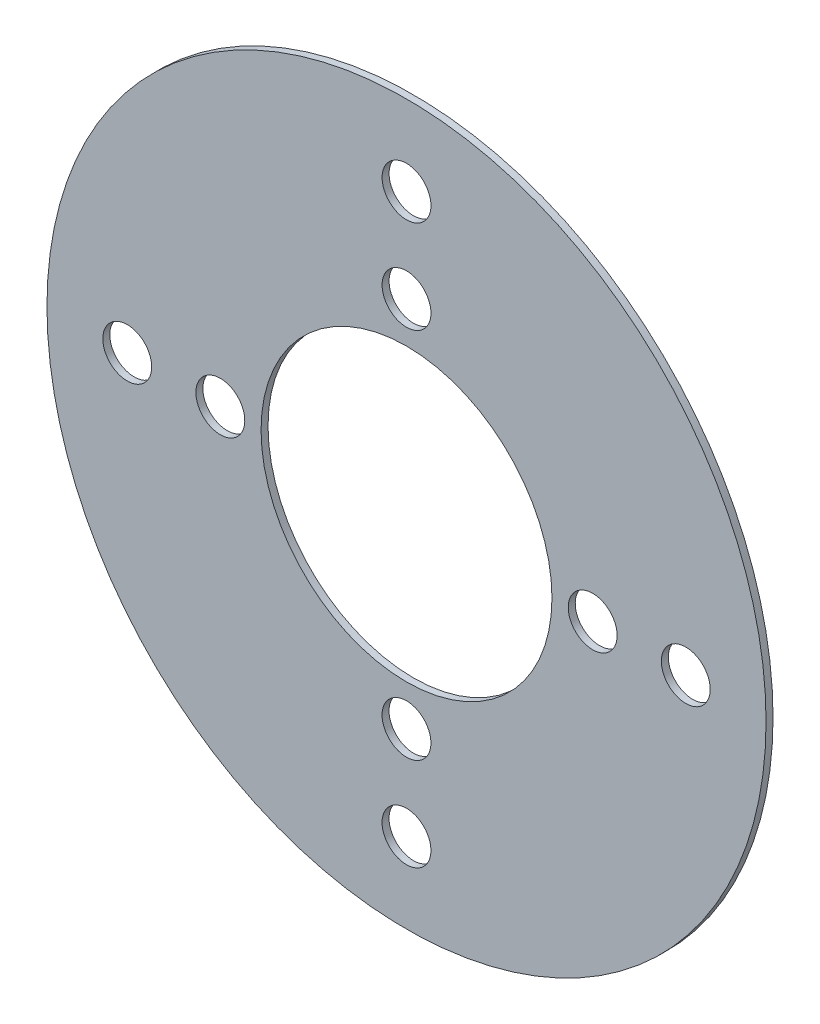
ISO-10303-21;
HEADER;
FILE_DESCRIPTION(('STEP AP214'),'2;1');
FILE_NAME('part.step','',(''),(''),'','','');
FILE_SCHEMA(('AUTOMOTIVE_DESIGN { 1 0 10303 214 1 1 1 1 }'));
ENDSEC;
DATA;
#1=APPLICATION_CONTEXT('core data for automotive mechanical design processes');
#2=APPLICATION_PROTOCOL_DEFINITION('international standard','automotive_design',2000,#1);
#3=PRODUCT_CONTEXT('',#1,'mechanical');
#4=PRODUCT('Part','Part','',(#3));
#5=PRODUCT_RELATED_PRODUCT_CATEGORY('part','',(#4));
#6=PRODUCT_DEFINITION_FORMATION('','',#4);
#7=PRODUCT_DEFINITION_CONTEXT('part definition',#1,'design');
#8=PRODUCT_DEFINITION('design','',#6,#7);
#9=PRODUCT_DEFINITION_SHAPE('','',#8);
#10=(LENGTH_UNIT() NAMED_UNIT(*) SI_UNIT(.MILLI.,.METRE.));
#11=(NAMED_UNIT(*) PLANE_ANGLE_UNIT() SI_UNIT($,.RADIAN.));
#12=(NAMED_UNIT(*) SI_UNIT($,.STERADIAN.) SOLID_ANGLE_UNIT());
#13=UNCERTAINTY_MEASURE_WITH_UNIT(LENGTH_MEASURE(1.E-05),#10,'distance_accuracy_value','');
#14=(GEOMETRIC_REPRESENTATION_CONTEXT(3) GLOBAL_UNCERTAINTY_ASSIGNED_CONTEXT((#13)) GLOBAL_UNIT_ASSIGNED_CONTEXT((#10,
#11,#12)) REPRESENTATION_CONTEXT('',''));
#15=CARTESIAN_POINT('',(0.,0.,0.));
#16=DIRECTION('',(0.,0.,1.));
#17=DIRECTION('',(1.,0.,0.));
#18=AXIS2_PLACEMENT_3D('',#15,#16,#17);
#19=CARTESIAN_POINT('',(0.,0.,0.6));
#20=DIRECTION('',(0.,0.,1.));
#21=DIRECTION('',(1.,0.,0.));
#22=AXIS2_PLACEMENT_3D('',#19,#20,#21);
#23=PLANE('',#22);
#24=CARTESIAN_POINT('',(-16.,1.6759110426447E-13,0.6));
#25=DIRECTION('',(0.,0.,1.));
#26=DIRECTION('',(0.,1.,0.));
#27=AXIS2_PLACEMENT_3D('',#24,#25,#26);
#28=CIRCLE('',#27,2.1);
#29=CARTESIAN_POINT('',(-16.,2.10000000000017,0.6));
#30=VERTEX_POINT('',#29);
#31=EDGE_CURVE('E90',#30,#30,#28,.T.);
#32=ORIENTED_EDGE('',*,*,#31,.F.);
#33=EDGE_LOOP('',(#32));
#34=FACE_BOUND('',#33,.T.);
#35=CARTESIAN_POINT('',(0.,-16.,0.6));
#36=DIRECTION('',(0.,0.,1.));
#37=DIRECTION('',(-1.,0.,0.));
#38=AXIS2_PLACEMENT_3D('',#35,#36,#37);
#39=CIRCLE('',#38,2.1);
#40=CARTESIAN_POINT('',(-2.1,-16.,0.6));
#41=VERTEX_POINT('',#40);
#42=EDGE_CURVE('E84',#41,#41,#39,.T.);
#43=ORIENTED_EDGE('',*,*,#42,.F.);
#44=EDGE_LOOP('',(#43));
#45=FACE_BOUND('',#44,.T.);
#46=CARTESIAN_POINT('',(16.,0.,0.6));
#47=DIRECTION('',(0.,0.,1.));
#48=DIRECTION('',(0.,-1.,0.));
#49=AXIS2_PLACEMENT_3D('',#46,#47,#48);
#50=CIRCLE('',#49,2.1);
#51=CARTESIAN_POINT('',(16.,-2.10000000000006,0.6));
#52=VERTEX_POINT('',#51);
#53=EDGE_CURVE('E78',#52,#52,#50,.T.);
#54=ORIENTED_EDGE('',*,*,#53,.F.);
#55=EDGE_LOOP('',(#54));
#56=FACE_BOUND('',#55,.T.);
#57=CARTESIAN_POINT('',(-24.,2.51386656396706E-13,0.6));
#58=DIRECTION('',(0.,0.,1.));
#59=DIRECTION('',(0.,1.,0.));
#60=AXIS2_PLACEMENT_3D('',#57,#58,#59);
#61=CIRCLE('',#60,2.1);
#62=CARTESIAN_POINT('',(-24.,2.10000000000025,0.6));
#63=VERTEX_POINT('',#62);
#64=EDGE_CURVE('E72',#63,#63,#61,.T.);
#65=ORIENTED_EDGE('',*,*,#64,.F.);
#66=EDGE_LOOP('',(#65));
#67=FACE_BOUND('',#66,.T.);
#68=CARTESIAN_POINT('',(0.,-24.,0.6));
#69=DIRECTION('',(0.,0.,1.));
#70=DIRECTION('',(-1.,0.,0.));
#71=AXIS2_PLACEMENT_3D('',#68,#69,#70);
#72=CIRCLE('',#71,2.1);
#73=CARTESIAN_POINT('',(-2.1,-24.,0.6));
#74=VERTEX_POINT('',#73);
#75=EDGE_CURVE('E66',#74,#74,#72,.T.);
#76=ORIENTED_EDGE('',*,*,#75,.F.);
#77=EDGE_LOOP('',(#76));
#78=FACE_BOUND('',#77,.T.);
#79=CARTESIAN_POINT('',(24.,0.,0.6));
#80=DIRECTION('',(0.,0.,1.));
#81=DIRECTION('',(0.,-1.,0.));
#82=AXIS2_PLACEMENT_3D('',#79,#80,#81);
#83=CIRCLE('',#82,2.1);
#84=CARTESIAN_POINT('',(24.,-2.10000000000008,0.6));
#85=VERTEX_POINT('',#84);
#86=EDGE_CURVE('E58',#85,#85,#83,.T.);
#87=ORIENTED_EDGE('',*,*,#86,.F.);
#88=EDGE_LOOP('',(#87));
#89=FACE_BOUND('',#88,.T.);
#90=CARTESIAN_POINT('',(0.,24.,0.6));
#91=DIRECTION('',(0.,0.,1.));
#92=DIRECTION('',(1.,0.,0.));
#93=AXIS2_PLACEMENT_3D('',#90,#91,#92);
#94=CIRCLE('',#93,2.1);
#95=CARTESIAN_POINT('',(2.1,24.,0.6));
#96=VERTEX_POINT('',#95);
#97=EDGE_CURVE('E55',#96,#96,#94,.T.);
#98=ORIENTED_EDGE('',*,*,#97,.F.);
#99=EDGE_LOOP('',(#98));
#100=FACE_BOUND('',#99,.T.);
#101=CARTESIAN_POINT('',(0.,16.,0.6));
#102=DIRECTION('',(0.,0.,1.));
#103=DIRECTION('',(1.,0.,0.));
#104=AXIS2_PLACEMENT_3D('',#101,#102,#103);
#105=CIRCLE('',#104,2.1);
#106=CARTESIAN_POINT('',(2.1,16.,0.6));
#107=VERTEX_POINT('',#106);
#108=EDGE_CURVE('E49',#107,#107,#105,.T.);
#109=ORIENTED_EDGE('',*,*,#108,.F.);
#110=EDGE_LOOP('',(#109));
#111=FACE_BOUND('',#110,.T.);
#112=CARTESIAN_POINT('',(0.,0.,0.6));
#113=DIRECTION('',(0.,0.,1.));
#114=DIRECTION('',(1.,0.,0.));
#115=AXIS2_PLACEMENT_3D('',#112,#113,#114);
#116=CIRCLE('',#115,30.9);
#117=CARTESIAN_POINT('',(30.9,0.,0.6));
#118=VERTEX_POINT('',#117);
#119=EDGE_CURVE('E10',#118,#118,#116,.T.);
#120=ORIENTED_EDGE('',*,*,#119,.T.);
#121=EDGE_LOOP('',(#120));
#122=FACE_BOUND('',#121,.T.);
#123=CARTESIAN_POINT('',(0.,0.,0.6));
#124=DIRECTION('',(0.,0.,1.));
#125=DIRECTION('',(1.,0.,0.));
#126=AXIS2_PLACEMENT_3D('',#123,#124,#125);
#127=CIRCLE('',#126,12.5);
#128=CARTESIAN_POINT('',(12.5,0.,0.6));
#129=VERTEX_POINT('',#128);
#130=EDGE_CURVE('E41',#129,#129,#127,.T.);
#131=ORIENTED_EDGE('',*,*,#130,.F.);
#132=EDGE_LOOP('',(#131));
#133=FACE_BOUND('',#132,.T.);
#134=ADVANCED_FACE('F30',(#34,#45,#56,#67,#78,#89,#100,#111,#122,#133),#23,.T.);
#135=CARTESIAN_POINT('',(0.,0.,0.));
#136=DIRECTION('',(0.,0.,1.));
#137=DIRECTION('',(1.,0.,0.));
#138=AXIS2_PLACEMENT_3D('',#135,#136,#137);
#139=PLANE('',#138);
#140=CARTESIAN_POINT('',(-16.,1.6759110426447E-13,0.));
#141=DIRECTION('',(0.,0.,1.));
#142=DIRECTION('',(0.,1.,0.));
#143=AXIS2_PLACEMENT_3D('',#140,#141,#142);
#144=CIRCLE('',#143,2.1);
#145=CARTESIAN_POINT('',(-16.,2.10000000000017,0.));
#146=VERTEX_POINT('',#145);
#147=EDGE_CURVE('E93',#146,#146,#144,.T.);
#148=ORIENTED_EDGE('',*,*,#147,.T.);
#149=EDGE_LOOP('',(#148));
#150=FACE_BOUND('',#149,.T.);
#151=CARTESIAN_POINT('',(0.,-16.,0.));
#152=DIRECTION('',(0.,0.,1.));
#153=DIRECTION('',(-1.,0.,0.));
#154=AXIS2_PLACEMENT_3D('',#151,#152,#153);
#155=CIRCLE('',#154,2.1);
#156=CARTESIAN_POINT('',(-2.1,-16.,0.));
#157=VERTEX_POINT('',#156);
#158=EDGE_CURVE('E87',#157,#157,#155,.T.);
#159=ORIENTED_EDGE('',*,*,#158,.T.);
#160=EDGE_LOOP('',(#159));
#161=FACE_BOUND('',#160,.T.);
#162=CARTESIAN_POINT('',(16.,0.,0.));
#163=DIRECTION('',(0.,0.,1.));
#164=DIRECTION('',(0.,-1.,0.));
#165=AXIS2_PLACEMENT_3D('',#162,#163,#164);
#166=CIRCLE('',#165,2.1);
#167=CARTESIAN_POINT('',(16.,-2.10000000000006,0.));
#168=VERTEX_POINT('',#167);
#169=EDGE_CURVE('E81',#168,#168,#166,.T.);
#170=ORIENTED_EDGE('',*,*,#169,.T.);
#171=EDGE_LOOP('',(#170));
#172=FACE_BOUND('',#171,.T.);
#173=CARTESIAN_POINT('',(-24.,2.51386656396706E-13,0.));
#174=DIRECTION('',(0.,0.,1.));
#175=DIRECTION('',(0.,1.,0.));
#176=AXIS2_PLACEMENT_3D('',#173,#174,#175);
#177=CIRCLE('',#176,2.1);
#178=CARTESIAN_POINT('',(-24.,2.10000000000025,0.));
#179=VERTEX_POINT('',#178);
#180=EDGE_CURVE('E75',#179,#179,#177,.T.);
#181=ORIENTED_EDGE('',*,*,#180,.T.);
#182=EDGE_LOOP('',(#181));
#183=FACE_BOUND('',#182,.T.);
#184=CARTESIAN_POINT('',(0.,-24.,0.));
#185=DIRECTION('',(0.,0.,1.));
#186=DIRECTION('',(-1.,0.,0.));
#187=AXIS2_PLACEMENT_3D('',#184,#185,#186);
#188=CIRCLE('',#187,2.1);
#189=CARTESIAN_POINT('',(-2.1,-24.,0.));
#190=VERTEX_POINT('',#189);
#191=EDGE_CURVE('E69',#190,#190,#188,.T.);
#192=ORIENTED_EDGE('',*,*,#191,.T.);
#193=EDGE_LOOP('',(#192));
#194=FACE_BOUND('',#193,.T.);
#195=CARTESIAN_POINT('',(24.,0.,0.));
#196=DIRECTION('',(0.,0.,1.));
#197=DIRECTION('',(0.,-1.,0.));
#198=AXIS2_PLACEMENT_3D('',#195,#196,#197);
#199=CIRCLE('',#198,2.1);
#200=CARTESIAN_POINT('',(24.,-2.10000000000008,0.));
#201=VERTEX_POINT('',#200);
#202=EDGE_CURVE('E63',#201,#201,#199,.T.);
#203=ORIENTED_EDGE('',*,*,#202,.T.);
#204=EDGE_LOOP('',(#203));
#205=FACE_BOUND('',#204,.T.);
#206=CARTESIAN_POINT('',(0.,24.,0.));
#207=DIRECTION('',(0.,0.,1.));
#208=DIRECTION('',(1.,0.,0.));
#209=AXIS2_PLACEMENT_3D('',#206,#207,#208);
#210=CIRCLE('',#209,2.1);
#211=CARTESIAN_POINT('',(2.1,24.,0.));
#212=VERTEX_POINT('',#211);
#213=EDGE_CURVE('E52',#212,#212,#210,.T.);
#214=ORIENTED_EDGE('',*,*,#213,.T.);
#215=EDGE_LOOP('',(#214));
#216=FACE_BOUND('',#215,.T.);
#217=CARTESIAN_POINT('',(0.,16.,0.));
#218=DIRECTION('',(0.,0.,1.));
#219=DIRECTION('',(1.,0.,0.));
#220=AXIS2_PLACEMENT_3D('',#217,#218,#219);
#221=CIRCLE('',#220,2.1);
#222=CARTESIAN_POINT('',(2.1,16.,0.));
#223=VERTEX_POINT('',#222);
#224=EDGE_CURVE('E46',#223,#223,#221,.T.);
#225=ORIENTED_EDGE('',*,*,#224,.T.);
#226=EDGE_LOOP('',(#225));
#227=FACE_BOUND('',#226,.T.);
#228=CARTESIAN_POINT('',(0.,0.,0.));
#229=DIRECTION('',(0.,0.,1.));
#230=DIRECTION('',(1.,0.,0.));
#231=AXIS2_PLACEMENT_3D('',#228,#229,#230);
#232=CIRCLE('',#231,30.9);
#233=CARTESIAN_POINT('',(30.9,0.,0.));
#234=VERTEX_POINT('',#233);
#235=EDGE_CURVE('E34',#234,#234,#232,.T.);
#236=ORIENTED_EDGE('',*,*,#235,.F.);
#237=EDGE_LOOP('',(#236));
#238=FACE_BOUND('',#237,.T.);
#239=CARTESIAN_POINT('',(0.,0.,0.));
#240=DIRECTION('',(0.,0.,1.));
#241=DIRECTION('',(1.,0.,0.));
#242=AXIS2_PLACEMENT_3D('',#239,#240,#241);
#243=CIRCLE('',#242,12.5);
#244=CARTESIAN_POINT('',(12.5,0.,0.));
#245=VERTEX_POINT('',#244);
#246=EDGE_CURVE('E43',#245,#245,#243,.T.);
#247=ORIENTED_EDGE('',*,*,#246,.T.);
#248=EDGE_LOOP('',(#247));
#249=FACE_BOUND('',#248,.T.);
#250=ADVANCED_FACE('F97',(#150,#161,#172,#183,#194,#205,#216,#227,#238,#249),#139,.F.);
#251=CARTESIAN_POINT('',(0.,0.,0.6));
#252=DIRECTION('',(0.,0.,-1.));
#253=DIRECTION('',(-1.,0.,0.));
#254=AXIS2_PLACEMENT_3D('',#251,#252,#253);
#255=CYLINDRICAL_SURFACE('',#254,30.9);
#256=ORIENTED_EDGE('',*,*,#119,.F.);
#257=EDGE_LOOP('',(#256));
#258=FACE_BOUND('',#257,.T.);
#259=ORIENTED_EDGE('',*,*,#235,.T.);
#260=EDGE_LOOP('',(#259));
#261=FACE_BOUND('',#260,.T.);
#262=ADVANCED_FACE('F32',(#258,#261),#255,.T.);
#263=CARTESIAN_POINT('',(0.,0.,0.6));
#264=DIRECTION('',(0.,0.,-1.));
#265=DIRECTION('',(-1.,0.,0.));
#266=AXIS2_PLACEMENT_3D('',#263,#264,#265);
#267=CYLINDRICAL_SURFACE('',#266,12.5);
#268=ORIENTED_EDGE('',*,*,#130,.T.);
#269=EDGE_LOOP('',(#268));
#270=FACE_BOUND('',#269,.T.);
#271=ORIENTED_EDGE('',*,*,#246,.F.);
#272=EDGE_LOOP('',(#271));
#273=FACE_BOUND('',#272,.T.);
#274=ADVANCED_FACE('F126',(#270,#273),#267,.F.);
#275=CARTESIAN_POINT('',(0.,16.,0.));
#276=DIRECTION('',(0.,0.,1.));
#277=DIRECTION('',(1.,0.,0.));
#278=AXIS2_PLACEMENT_3D('',#275,#276,#277);
#279=CYLINDRICAL_SURFACE('',#278,2.1);
#280=ORIENTED_EDGE('',*,*,#224,.F.);
#281=EDGE_LOOP('',(#280));
#282=FACE_BOUND('',#281,.T.);
#283=ORIENTED_EDGE('',*,*,#108,.T.);
#284=EDGE_LOOP('',(#283));
#285=FACE_BOUND('',#284,.T.);
#286=ADVANCED_FACE('F129',(#282,#285),#279,.F.);
#287=CARTESIAN_POINT('',(0.,24.,0.));
#288=DIRECTION('',(0.,0.,1.));
#289=DIRECTION('',(1.,0.,0.));
#290=AXIS2_PLACEMENT_3D('',#287,#288,#289);
#291=CYLINDRICAL_SURFACE('',#290,2.1);
#292=ORIENTED_EDGE('',*,*,#213,.F.);
#293=EDGE_LOOP('',(#292));
#294=FACE_BOUND('',#293,.T.);
#295=ORIENTED_EDGE('',*,*,#97,.T.);
#296=EDGE_LOOP('',(#295));
#297=FACE_BOUND('',#296,.T.);
#298=ADVANCED_FACE('F141',(#294,#297),#291,.F.);
#299=CARTESIAN_POINT('',(24.,0.,0.));
#300=DIRECTION('',(0.,0.,1.));
#301=DIRECTION('',(0.,-1.,0.));
#302=AXIS2_PLACEMENT_3D('',#299,#300,#301);
#303=CYLINDRICAL_SURFACE('',#302,2.1);
#304=ORIENTED_EDGE('',*,*,#202,.F.);
#305=EDGE_LOOP('',(#304));
#306=FACE_BOUND('',#305,.T.);
#307=ORIENTED_EDGE('',*,*,#86,.T.);
#308=EDGE_LOOP('',(#307));
#309=FACE_BOUND('',#308,.T.);
#310=ADVANCED_FACE('F145',(#306,#309),#303,.F.);
#311=CARTESIAN_POINT('',(0.,-24.,0.));
#312=DIRECTION('',(0.,0.,1.));
#313=DIRECTION('',(-1.,0.,0.));
#314=AXIS2_PLACEMENT_3D('',#311,#312,#313);
#315=CYLINDRICAL_SURFACE('',#314,2.1);
#316=ORIENTED_EDGE('',*,*,#191,.F.);
#317=EDGE_LOOP('',(#316));
#318=FACE_BOUND('',#317,.T.);
#319=ORIENTED_EDGE('',*,*,#75,.T.);
#320=EDGE_LOOP('',(#319));
#321=FACE_BOUND('',#320,.T.);
#322=ADVANCED_FACE('F149',(#318,#321),#315,.F.);
#323=CARTESIAN_POINT('',(-24.,2.51386656396706E-13,0.));
#324=DIRECTION('',(0.,0.,1.));
#325=DIRECTION('',(0.,1.,0.));
#326=AXIS2_PLACEMENT_3D('',#323,#324,#325);
#327=CYLINDRICAL_SURFACE('',#326,2.1);
#328=ORIENTED_EDGE('',*,*,#180,.F.);
#329=EDGE_LOOP('',(#328));
#330=FACE_BOUND('',#329,.T.);
#331=ORIENTED_EDGE('',*,*,#64,.T.);
#332=EDGE_LOOP('',(#331));
#333=FACE_BOUND('',#332,.T.);
#334=ADVANCED_FACE('F153',(#330,#333),#327,.F.);
#335=CARTESIAN_POINT('',(16.,0.,0.));
#336=DIRECTION('',(0.,0.,1.));
#337=DIRECTION('',(0.,-1.,0.));
#338=AXIS2_PLACEMENT_3D('',#335,#336,#337);
#339=CYLINDRICAL_SURFACE('',#338,2.1);
#340=ORIENTED_EDGE('',*,*,#169,.F.);
#341=EDGE_LOOP('',(#340));
#342=FACE_BOUND('',#341,.T.);
#343=ORIENTED_EDGE('',*,*,#53,.T.);
#344=EDGE_LOOP('',(#343));
#345=FACE_BOUND('',#344,.T.);
#346=ADVANCED_FACE('F157',(#342,#345),#339,.F.);
#347=CARTESIAN_POINT('',(0.,-16.,0.));
#348=DIRECTION('',(0.,0.,1.));
#349=DIRECTION('',(-1.,0.,0.));
#350=AXIS2_PLACEMENT_3D('',#347,#348,#349);
#351=CYLINDRICAL_SURFACE('',#350,2.1);
#352=ORIENTED_EDGE('',*,*,#158,.F.);
#353=EDGE_LOOP('',(#352));
#354=FACE_BOUND('',#353,.T.);
#355=ORIENTED_EDGE('',*,*,#42,.T.);
#356=EDGE_LOOP('',(#355));
#357=FACE_BOUND('',#356,.T.);
#358=ADVANCED_FACE('F103',(#354,#357),#351,.F.);
#359=CARTESIAN_POINT('',(-16.,1.6759110426447E-13,0.));
#360=DIRECTION('',(0.,0.,1.));
#361=DIRECTION('',(0.,1.,0.));
#362=AXIS2_PLACEMENT_3D('',#359,#360,#361);
#363=CYLINDRICAL_SURFACE('',#362,2.1);
#364=ORIENTED_EDGE('',*,*,#147,.F.);
#365=EDGE_LOOP('',(#364));
#366=FACE_BOUND('',#365,.T.);
#367=ORIENTED_EDGE('',*,*,#31,.T.);
#368=EDGE_LOOP('',(#367));
#369=FACE_BOUND('',#368,.T.);
#370=ADVANCED_FACE('F100',(#366,#369),#363,.F.);
#371=CLOSED_SHELL('',(#134,#250,#262,#274,#286,#298,#310,#322,#334,#346,#358,#370));
#372=MANIFOLD_SOLID_BREP('B2',#371);
#373=ADVANCED_BREP_SHAPE_REPRESENTATION('',(#18,#372),#14);
#374=SHAPE_DEFINITION_REPRESENTATION(#9,#373);
ENDSEC;
END-ISO-10303-21;
